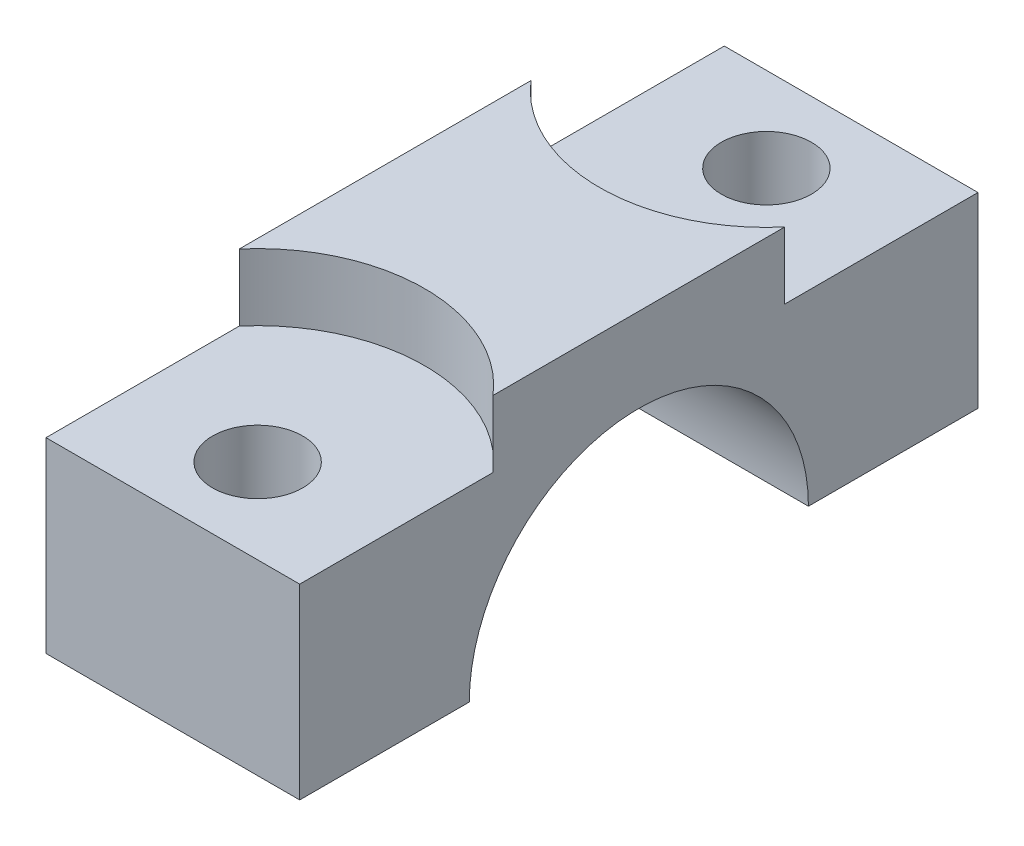
ISO-10303-21;
HEADER;
FILE_DESCRIPTION(('STEP AP214'),'2;1');
FILE_NAME('part.step','',(''),(''),'','','');
FILE_SCHEMA(('AUTOMOTIVE_DESIGN { 1 0 10303 214 1 1 1 1 }'));
ENDSEC;
DATA;
#1=APPLICATION_CONTEXT('core data for automotive mechanical design processes');
#2=APPLICATION_PROTOCOL_DEFINITION('international standard','automotive_design',2000,#1);
#3=PRODUCT_CONTEXT('',#1,'mechanical');
#4=PRODUCT('Part','Part','',(#3));
#5=PRODUCT_RELATED_PRODUCT_CATEGORY('part','',(#4));
#6=PRODUCT_DEFINITION_FORMATION('','',#4);
#7=PRODUCT_DEFINITION_CONTEXT('part definition',#1,'design');
#8=PRODUCT_DEFINITION('design','',#6,#7);
#9=PRODUCT_DEFINITION_SHAPE('','',#8);
#10=(LENGTH_UNIT() NAMED_UNIT(*) SI_UNIT(.MILLI.,.METRE.));
#11=(NAMED_UNIT(*) PLANE_ANGLE_UNIT() SI_UNIT($,.RADIAN.));
#12=(NAMED_UNIT(*) SI_UNIT($,.STERADIAN.) SOLID_ANGLE_UNIT());
#13=UNCERTAINTY_MEASURE_WITH_UNIT(LENGTH_MEASURE(1.E-05),#10,'distance_accuracy_value','');
#14=(GEOMETRIC_REPRESENTATION_CONTEXT(3) GLOBAL_UNCERTAINTY_ASSIGNED_CONTEXT((#13)) GLOBAL_UNIT_ASSIGNED_CONTEXT((#10,
#11,#12)) REPRESENTATION_CONTEXT('',''));
#15=CARTESIAN_POINT('',(0.,0.,0.));
#16=DIRECTION('',(0.,0.,1.));
#17=DIRECTION('',(1.,0.,0.));
#18=AXIS2_PLACEMENT_3D('',#15,#16,#17);
#19=CARTESIAN_POINT('',(9.5,0.,0.));
#20=DIRECTION('',(-1.,0.,0.));
#21=DIRECTION('',(0.,0.,1.));
#22=AXIS2_PLACEMENT_3D('',#19,#20,#21);
#23=CYLINDRICAL_SURFACE('',#22,12.7);
#24=CARTESIAN_POINT('',(-9.5,0.,0.));
#25=DIRECTION('',(1.,0.,0.));
#26=DIRECTION('',(0.,0.,-1.));
#27=AXIS2_PLACEMENT_3D('',#24,#25,#26);
#28=CIRCLE('',#27,12.7);
#29=CARTESIAN_POINT('',(-9.5,0.,-12.7));
#30=VERTEX_POINT('',#29);
#31=CARTESIAN_POINT('',(-9.5,0.,12.7));
#32=VERTEX_POINT('',#31);
#33=EDGE_CURVE('E173',#30,#32,#28,.T.);
#34=ORIENTED_EDGE('',*,*,#33,.F.);
#35=DIRECTION('',(-1.,0.,0.));
#36=VECTOR('',#35,1.);
#37=CARTESIAN_POINT('',(9.5,0.,-12.7));
#38=LINE('',#37,#36);
#39=CARTESIAN_POINT('',(9.5,0.,-12.7));
#40=VERTEX_POINT('',#39);
#41=EDGE_CURVE('E220',#40,#30,#38,.T.);
#42=ORIENTED_EDGE('',*,*,#41,.F.);
#43=CARTESIAN_POINT('',(9.5,0.,0.));
#44=DIRECTION('',(1.,0.,0.));
#45=DIRECTION('',(0.,0.,-1.));
#46=AXIS2_PLACEMENT_3D('',#43,#44,#45);
#47=CIRCLE('',#46,12.7);
#48=CARTESIAN_POINT('',(9.5,0.,12.7));
#49=VERTEX_POINT('',#48);
#50=EDGE_CURVE('E174',#40,#49,#47,.T.);
#51=ORIENTED_EDGE('',*,*,#50,.T.);
#52=DIRECTION('',(-1.,0.,0.));
#53=VECTOR('',#52,1.);
#54=CARTESIAN_POINT('',(9.5,0.,12.7));
#55=LINE('',#54,#53);
#56=EDGE_CURVE('E210',#49,#32,#55,.T.);
#57=ORIENTED_EDGE('',*,*,#56,.T.);
#58=EDGE_LOOP('',(#34,#42,#51,#57));
#59=FACE_BOUND('',#58,.T.);
#60=ADVANCED_FACE('F47',(#59),#23,.F.);
#61=CARTESIAN_POINT('',(9.5,0.,0.));
#62=DIRECTION('',(0.,1.,0.));
#63=DIRECTION('',(0.,0.,1.));
#64=AXIS2_PLACEMENT_3D('',#61,#62,#63);
#65=PLANE('',#64);
#66=CARTESIAN_POINT('',(0.,0.,-19.05));
#67=DIRECTION('',(0.,1.,0.));
#68=DIRECTION('',(0.,0.,1.));
#69=AXIS2_PLACEMENT_3D('',#66,#67,#68);
#70=CIRCLE('',#69,3.375);
#71=CARTESIAN_POINT('',(0.,0.,-15.675));
#72=VERTEX_POINT('',#71);
#73=EDGE_CURVE('E149',#72,#72,#70,.T.);
#74=ORIENTED_EDGE('',*,*,#73,.T.);
#75=EDGE_LOOP('',(#74));
#76=FACE_BOUND('',#75,.T.);
#77=DIRECTION('',(0.,0.,-1.));
#78=VECTOR('',#77,1.);
#79=CARTESIAN_POINT('',(-9.5,0.,0.));
#80=LINE('',#79,#78);
#81=CARTESIAN_POINT('',(-9.5,0.,-25.4));
#82=VERTEX_POINT('',#81);
#83=EDGE_CURVE('E195',#30,#82,#80,.T.);
#84=ORIENTED_EDGE('',*,*,#83,.T.);
#85=DIRECTION('',(-1.,0.,0.));
#86=VECTOR('',#85,1.);
#87=CARTESIAN_POINT('',(9.5,0.,-25.4));
#88=LINE('',#87,#86);
#89=CARTESIAN_POINT('',(9.5,0.,-25.4));
#90=VERTEX_POINT('',#89);
#91=EDGE_CURVE('E216',#90,#82,#88,.T.);
#92=ORIENTED_EDGE('',*,*,#91,.F.);
#93=DIRECTION('',(0.,0.,-1.));
#94=VECTOR('',#93,1.);
#95=CARTESIAN_POINT('',(9.5,0.,0.));
#96=LINE('',#95,#94);
#97=EDGE_CURVE('E178',#40,#90,#96,.T.);
#98=ORIENTED_EDGE('',*,*,#97,.F.);
#99=ORIENTED_EDGE('',*,*,#41,.T.);
#100=EDGE_LOOP('',(#84,#92,#98,#99));
#101=FACE_BOUND('',#100,.T.);
#102=ADVANCED_FACE('F242',(#76,#101),#65,.F.);
#103=CARTESIAN_POINT('',(9.5,0.,-25.4));
#104=DIRECTION('',(0.,0.,1.));
#105=DIRECTION('',(1.,0.,0.));
#106=AXIS2_PLACEMENT_3D('',#103,#104,#105);
#107=PLANE('',#106);
#108=DIRECTION('',(0.,1.,0.));
#109=VECTOR('',#108,1.);
#110=CARTESIAN_POINT('',(-9.5,0.,-25.4));
#111=LINE('',#110,#109);
#112=CARTESIAN_POINT('',(-9.5,14.,-25.4));
#113=VERTEX_POINT('',#112);
#114=EDGE_CURVE('E198',#82,#113,#111,.T.);
#115=ORIENTED_EDGE('',*,*,#114,.T.);
#116=DIRECTION('',(1.,0.,0.));
#117=VECTOR('',#116,1.);
#118=CARTESIAN_POINT('',(9.5,14.,-25.4));
#119=LINE('',#118,#117);
#120=CARTESIAN_POINT('',(9.5,14.,-25.4));
#121=VERTEX_POINT('',#120);
#122=EDGE_CURVE('E62',#113,#121,#119,.T.);
#123=ORIENTED_EDGE('',*,*,#122,.T.);
#124=DIRECTION('',(0.,1.,0.));
#125=VECTOR('',#124,1.);
#126=CARTESIAN_POINT('',(9.5,0.,-25.4));
#127=LINE('',#126,#125);
#128=EDGE_CURVE('E145',#90,#121,#127,.T.);
#129=ORIENTED_EDGE('',*,*,#128,.F.);
#130=ORIENTED_EDGE('',*,*,#91,.T.);
#131=EDGE_LOOP('',(#115,#123,#129,#130));
#132=FACE_BOUND('',#131,.T.);
#133=ADVANCED_FACE('F238',(#132),#107,.F.);
#134=CARTESIAN_POINT('',(9.5,19.,0.));
#135=DIRECTION('',(0.,1.,0.));
#136=DIRECTION('',(0.,0.,1.));
#137=AXIS2_PLACEMENT_3D('',#134,#135,#136);
#138=PLANE('',#137);
#139=CARTESIAN_POINT('',(0.,19.,-19.05));
#140=DIRECTION('',(0.,1.,0.));
#141=DIRECTION('',(0.,0.,1.));
#142=AXIS2_PLACEMENT_3D('',#139,#140,#141);
#143=CIRCLE('',#142,12.5);
#144=CARTESIAN_POINT('',(-9.5,19.,-10.925961595364));
#145=VERTEX_POINT('',#144);
#146=CARTESIAN_POINT('',(9.5,19.,-10.925961595364));
#147=VERTEX_POINT('',#146);
#148=EDGE_CURVE('E129',#145,#147,#143,.T.);
#149=ORIENTED_EDGE('',*,*,#148,.F.);
#150=DIRECTION('',(0.,0.,-1.));
#151=VECTOR('',#150,1.);
#152=CARTESIAN_POINT('',(-9.5,19.,0.));
#153=LINE('',#152,#151);
#154=CARTESIAN_POINT('',(-9.5,19.,10.925961595364));
#155=VERTEX_POINT('',#154);
#156=EDGE_CURVE('E202',#155,#145,#153,.T.);
#157=ORIENTED_EDGE('',*,*,#156,.F.);
#158=CARTESIAN_POINT('',(0.,19.,19.05));
#159=DIRECTION('',(0.,1.,0.));
#160=DIRECTION('',(0.,0.,1.));
#161=AXIS2_PLACEMENT_3D('',#158,#159,#160);
#162=CIRCLE('',#161,12.5);
#163=CARTESIAN_POINT('',(9.5,19.,10.925961595364));
#164=VERTEX_POINT('',#163);
#165=EDGE_CURVE('E70',#164,#155,#162,.T.);
#166=ORIENTED_EDGE('',*,*,#165,.F.);
#167=DIRECTION('',(0.,0.,-1.));
#168=VECTOR('',#167,1.);
#169=CARTESIAN_POINT('',(9.5,19.,0.));
#170=LINE('',#169,#168);
#171=EDGE_CURVE('E185',#164,#147,#170,.T.);
#172=ORIENTED_EDGE('',*,*,#171,.T.);
#173=EDGE_LOOP('',(#149,#157,#166,#172));
#174=FACE_BOUND('',#173,.T.);
#175=ADVANCED_FACE('F268',(#174),#138,.T.);
#176=CARTESIAN_POINT('',(9.5,0.,25.4));
#177=DIRECTION('',(0.,0.,1.));
#178=DIRECTION('',(1.,0.,0.));
#179=AXIS2_PLACEMENT_3D('',#176,#177,#178);
#180=PLANE('',#179);
#181=DIRECTION('',(1.,0.,0.));
#182=VECTOR('',#181,1.);
#183=CARTESIAN_POINT('',(9.5,14.,25.4));
#184=LINE('',#183,#182);
#185=CARTESIAN_POINT('',(-9.5,14.,25.4));
#186=VERTEX_POINT('',#185);
#187=CARTESIAN_POINT('',(9.5,14.,25.4));
#188=VERTEX_POINT('',#187);
#189=EDGE_CURVE('E170',#186,#188,#184,.T.);
#190=ORIENTED_EDGE('',*,*,#189,.F.);
#191=DIRECTION('',(0.,1.,0.));
#192=VECTOR('',#191,1.);
#193=CARTESIAN_POINT('',(-9.5,0.,25.4));
#194=LINE('',#193,#192);
#195=CARTESIAN_POINT('',(-9.5,0.,25.4));
#196=VERTEX_POINT('',#195);
#197=EDGE_CURVE('E206',#196,#186,#194,.T.);
#198=ORIENTED_EDGE('',*,*,#197,.F.);
#199=DIRECTION('',(-1.,0.,0.));
#200=VECTOR('',#199,1.);
#201=CARTESIAN_POINT('',(9.5,0.,25.4));
#202=LINE('',#201,#200);
#203=CARTESIAN_POINT('',(9.5,0.,25.4));
#204=VERTEX_POINT('',#203);
#205=EDGE_CURVE('E213',#204,#196,#202,.T.);
#206=ORIENTED_EDGE('',*,*,#205,.F.);
#207=DIRECTION('',(0.,1.,0.));
#208=VECTOR('',#207,1.);
#209=CARTESIAN_POINT('',(9.5,0.,25.4));
#210=LINE('',#209,#208);
#211=EDGE_CURVE('E188',#204,#188,#210,.T.);
#212=ORIENTED_EDGE('',*,*,#211,.T.);
#213=EDGE_LOOP('',(#190,#198,#206,#212));
#214=FACE_BOUND('',#213,.T.);
#215=ADVANCED_FACE('F260',(#214),#180,.T.);
#216=CARTESIAN_POINT('',(0.,0.,19.05));
#217=DIRECTION('',(0.,1.,0.));
#218=DIRECTION('',(0.,0.,1.));
#219=AXIS2_PLACEMENT_3D('',#216,#217,#218);
#220=CIRCLE('',#219,3.375);
#221=CARTESIAN_POINT('',(0.,0.,22.425));
#222=VERTEX_POINT('',#221);
#223=EDGE_CURVE('E163',#222,#222,#220,.T.);
#224=ORIENTED_EDGE('',*,*,#223,.T.);
#225=EDGE_LOOP('',(#224));
#226=FACE_BOUND('',#225,.T.);
#227=EDGE_CURVE('E179',#196,#32,#80,.T.);
#228=ORIENTED_EDGE('',*,*,#227,.T.);
#229=ORIENTED_EDGE('',*,*,#56,.F.);
#230=EDGE_CURVE('E182',#204,#49,#96,.T.);
#231=ORIENTED_EDGE('',*,*,#230,.F.);
#232=ORIENTED_EDGE('',*,*,#205,.T.);
#233=EDGE_LOOP('',(#228,#229,#231,#232));
#234=FACE_BOUND('',#233,.T.);
#235=ADVANCED_FACE('F251',(#226,#234),#65,.F.);
#236=CARTESIAN_POINT('',(9.5,0.,0.));
#237=DIRECTION('',(1.,0.,0.));
#238=DIRECTION('',(0.,0.,-1.));
#239=AXIS2_PLACEMENT_3D('',#236,#237,#238);
#240=PLANE('',#239);
#241=DIRECTION('',(0.,0.,-1.));
#242=VECTOR('',#241,1.);
#243=CARTESIAN_POINT('',(9.5,14.,0.));
#244=LINE('',#243,#242);
#245=CARTESIAN_POINT('',(9.5,14.,-10.925961595364));
#246=VERTEX_POINT('',#245);
#247=EDGE_CURVE('E135',#246,#121,#244,.T.);
#248=ORIENTED_EDGE('',*,*,#247,.F.);
#249=DIRECTION('',(0.,1.,0.));
#250=VECTOR('',#249,1.);
#251=CARTESIAN_POINT('',(9.5,19.,-10.925961595364));
#252=LINE('',#251,#250);
#253=EDGE_CURVE('E124',#147,#246,#252,.F.);
#254=ORIENTED_EDGE('',*,*,#253,.F.);
#255=ORIENTED_EDGE('',*,*,#171,.F.);
#256=DIRECTION('',(0.,1.,0.));
#257=VECTOR('',#256,1.);
#258=CARTESIAN_POINT('',(9.5,19.,10.925961595364));
#259=LINE('',#258,#257);
#260=CARTESIAN_POINT('',(9.5,14.,10.925961595364));
#261=VERTEX_POINT('',#260);
#262=EDGE_CURVE('E167',#261,#164,#259,.T.);
#263=ORIENTED_EDGE('',*,*,#262,.F.);
#264=DIRECTION('',(0.,0.,-1.));
#265=VECTOR('',#264,1.);
#266=CARTESIAN_POINT('',(9.5,14.,0.));
#267=LINE('',#266,#265);
#268=EDGE_CURVE('E230',#188,#261,#267,.T.);
#269=ORIENTED_EDGE('',*,*,#268,.F.);
#270=ORIENTED_EDGE('',*,*,#211,.F.);
#271=ORIENTED_EDGE('',*,*,#230,.T.);
#272=ORIENTED_EDGE('',*,*,#50,.F.);
#273=ORIENTED_EDGE('',*,*,#97,.T.);
#274=ORIENTED_EDGE('',*,*,#128,.T.);
#275=EDGE_LOOP('',(#248,#254,#255,#263,#269,#270,#271,#272,#273,#274));
#276=FACE_BOUND('',#275,.T.);
#277=ADVANCED_FACE('F143',(#276),#240,.T.);
#278=CARTESIAN_POINT('',(-9.5,0.,0.));
#279=DIRECTION('',(1.,0.,0.));
#280=DIRECTION('',(0.,0.,-1.));
#281=AXIS2_PLACEMENT_3D('',#278,#279,#280);
#282=PLANE('',#281);
#283=ORIENTED_EDGE('',*,*,#156,.T.);
#284=DIRECTION('',(0.,1.,0.));
#285=VECTOR('',#284,1.);
#286=CARTESIAN_POINT('',(-9.5,19.,-10.925961595364));
#287=LINE('',#286,#285);
#288=CARTESIAN_POINT('',(-9.5,14.,-10.925961595364));
#289=VERTEX_POINT('',#288);
#290=EDGE_CURVE('E11',#145,#289,#287,.F.);
#291=ORIENTED_EDGE('',*,*,#290,.T.);
#292=DIRECTION('',(0.,0.,-1.));
#293=VECTOR('',#292,1.);
#294=CARTESIAN_POINT('',(-9.5,14.,0.));
#295=LINE('',#294,#293);
#296=EDGE_CURVE('E55',#289,#113,#295,.T.);
#297=ORIENTED_EDGE('',*,*,#296,.T.);
#298=ORIENTED_EDGE('',*,*,#114,.F.);
#299=ORIENTED_EDGE('',*,*,#83,.F.);
#300=ORIENTED_EDGE('',*,*,#33,.T.);
#301=ORIENTED_EDGE('',*,*,#227,.F.);
#302=ORIENTED_EDGE('',*,*,#197,.T.);
#303=DIRECTION('',(0.,0.,-1.));
#304=VECTOR('',#303,1.);
#305=CARTESIAN_POINT('',(-9.5,14.,0.));
#306=LINE('',#305,#304);
#307=CARTESIAN_POINT('',(-9.5,14.,10.925961595364));
#308=VERTEX_POINT('',#307);
#309=EDGE_CURVE('E226',#186,#308,#306,.T.);
#310=ORIENTED_EDGE('',*,*,#309,.T.);
#311=DIRECTION('',(0.,1.,0.));
#312=VECTOR('',#311,1.);
#313=CARTESIAN_POINT('',(-9.5,19.,10.925961595364));
#314=LINE('',#313,#312);
#315=EDGE_CURVE('E223',#308,#155,#314,.T.);
#316=ORIENTED_EDGE('',*,*,#315,.T.);
#317=EDGE_LOOP('',(#283,#291,#297,#298,#299,#300,#301,#302,#310,#316));
#318=FACE_BOUND('',#317,.T.);
#319=ADVANCED_FACE('F235',(#318),#282,.F.);
#320=CARTESIAN_POINT('',(0.,19.,19.05));
#321=DIRECTION('',(0.,1.,0.));
#322=DIRECTION('',(0.,0.,1.));
#323=AXIS2_PLACEMENT_3D('',#320,#321,#322);
#324=CYLINDRICAL_SURFACE('',#323,3.375);
#325=ORIENTED_EDGE('',*,*,#223,.F.);
#326=EDGE_LOOP('',(#325));
#327=FACE_BOUND('',#326,.T.);
#328=CARTESIAN_POINT('',(0.,14.,19.05));
#329=DIRECTION('',(0.,1.,0.));
#330=DIRECTION('',(0.,0.,1.));
#331=AXIS2_PLACEMENT_3D('',#328,#329,#330);
#332=CIRCLE('',#331,3.375);
#333=CARTESIAN_POINT('',(0.,14.,22.425));
#334=VERTEX_POINT('',#333);
#335=EDGE_CURVE('E159',#334,#334,#332,.T.);
#336=ORIENTED_EDGE('',*,*,#335,.T.);
#337=EDGE_LOOP('',(#336));
#338=FACE_BOUND('',#337,.T.);
#339=ADVANCED_FACE('F309',(#327,#338),#324,.F.);
#340=CARTESIAN_POINT('',(3.375,14.,19.05));
#341=DIRECTION('',(0.,-1.,0.));
#342=DIRECTION('',(0.,0.,-1.));
#343=AXIS2_PLACEMENT_3D('',#340,#341,#342);
#344=PLANE('',#343);
#345=ORIENTED_EDGE('',*,*,#268,.T.);
#346=CARTESIAN_POINT('',(0.,14.,19.05));
#347=DIRECTION('',(0.,1.,0.));
#348=DIRECTION('',(0.,0.,1.));
#349=AXIS2_PLACEMENT_3D('',#346,#347,#348);
#350=CIRCLE('',#349,12.5);
#351=EDGE_CURVE('E155',#261,#308,#350,.T.);
#352=ORIENTED_EDGE('',*,*,#351,.T.);
#353=ORIENTED_EDGE('',*,*,#309,.F.);
#354=ORIENTED_EDGE('',*,*,#189,.T.);
#355=EDGE_LOOP('',(#345,#352,#353,#354));
#356=FACE_BOUND('',#355,.T.);
#357=ORIENTED_EDGE('',*,*,#335,.F.);
#358=EDGE_LOOP('',(#357));
#359=FACE_BOUND('',#358,.T.);
#360=ADVANCED_FACE('F263',(#356,#359),#344,.F.);
#361=CARTESIAN_POINT('',(0.,19.,19.05));
#362=DIRECTION('',(0.,1.,0.));
#363=DIRECTION('',(0.,0.,1.));
#364=AXIS2_PLACEMENT_3D('',#361,#362,#363);
#365=CYLINDRICAL_SURFACE('',#364,12.5);
#366=ORIENTED_EDGE('',*,*,#262,.T.);
#367=ORIENTED_EDGE('',*,*,#165,.T.);
#368=ORIENTED_EDGE('',*,*,#315,.F.);
#369=ORIENTED_EDGE('',*,*,#351,.F.);
#370=EDGE_LOOP('',(#366,#367,#368,#369));
#371=FACE_BOUND('',#370,.T.);
#372=ADVANCED_FACE('F266',(#371),#365,.F.);
#373=CARTESIAN_POINT('',(0.,19.,-19.05));
#374=DIRECTION('',(0.,1.,0.));
#375=DIRECTION('',(0.,0.,1.));
#376=AXIS2_PLACEMENT_3D('',#373,#374,#375);
#377=CYLINDRICAL_SURFACE('',#376,3.375);
#378=ORIENTED_EDGE('',*,*,#73,.F.);
#379=EDGE_LOOP('',(#378));
#380=FACE_BOUND('',#379,.T.);
#381=CARTESIAN_POINT('',(0.,14.,-19.05));
#382=DIRECTION('',(0.,1.,0.));
#383=DIRECTION('',(0.,0.,1.));
#384=AXIS2_PLACEMENT_3D('',#381,#382,#383);
#385=CIRCLE('',#384,3.375);
#386=CARTESIAN_POINT('',(0.,14.,-15.675));
#387=VERTEX_POINT('',#386);
#388=EDGE_CURVE('E140',#387,#387,#385,.T.);
#389=ORIENTED_EDGE('',*,*,#388,.T.);
#390=EDGE_LOOP('',(#389));
#391=FACE_BOUND('',#390,.T.);
#392=ADVANCED_FACE('F279',(#380,#391),#377,.F.);
#393=CARTESIAN_POINT('',(3.375,14.,-19.05));
#394=DIRECTION('',(0.,-1.,0.));
#395=DIRECTION('',(0.,0.,-1.));
#396=AXIS2_PLACEMENT_3D('',#393,#394,#395);
#397=PLANE('',#396);
#398=ORIENTED_EDGE('',*,*,#247,.T.);
#399=ORIENTED_EDGE('',*,*,#122,.F.);
#400=ORIENTED_EDGE('',*,*,#296,.F.);
#401=CARTESIAN_POINT('',(0.,14.,-19.05));
#402=DIRECTION('',(0.,1.,0.));
#403=DIRECTION('',(0.,0.,1.));
#404=AXIS2_PLACEMENT_3D('',#401,#402,#403);
#405=CIRCLE('',#404,12.5);
#406=EDGE_CURVE('E127',#289,#246,#405,.T.);
#407=ORIENTED_EDGE('',*,*,#406,.T.);
#408=EDGE_LOOP('',(#398,#399,#400,#407));
#409=FACE_BOUND('',#408,.T.);
#410=ORIENTED_EDGE('',*,*,#388,.F.);
#411=EDGE_LOOP('',(#410));
#412=FACE_BOUND('',#411,.T.);
#413=ADVANCED_FACE('F137',(#409,#412),#397,.F.);
#414=CARTESIAN_POINT('',(0.,19.,-19.05));
#415=DIRECTION('',(0.,1.,0.));
#416=DIRECTION('',(0.,0.,1.));
#417=AXIS2_PLACEMENT_3D('',#414,#415,#416);
#418=CYLINDRICAL_SURFACE('',#417,12.5);
#419=ORIENTED_EDGE('',*,*,#253,.T.);
#420=ORIENTED_EDGE('',*,*,#406,.F.);
#421=ORIENTED_EDGE('',*,*,#290,.F.);
#422=ORIENTED_EDGE('',*,*,#148,.T.);
#423=EDGE_LOOP('',(#419,#420,#421,#422));
#424=FACE_BOUND('',#423,.T.);
#425=ADVANCED_FACE('F126',(#424),#418,.F.);
#426=CLOSED_SHELL('',(#60,#102,#133,#175,#215,#235,#277,#319,#339,#360,#372,#392,#413,#425));
#427=MANIFOLD_SOLID_BREP('B2',#426);
#428=ADVANCED_BREP_SHAPE_REPRESENTATION('',(#18,#427),#14);
#429=SHAPE_DEFINITION_REPRESENTATION(#9,#428);
ENDSEC;
END-ISO-10303-21;
